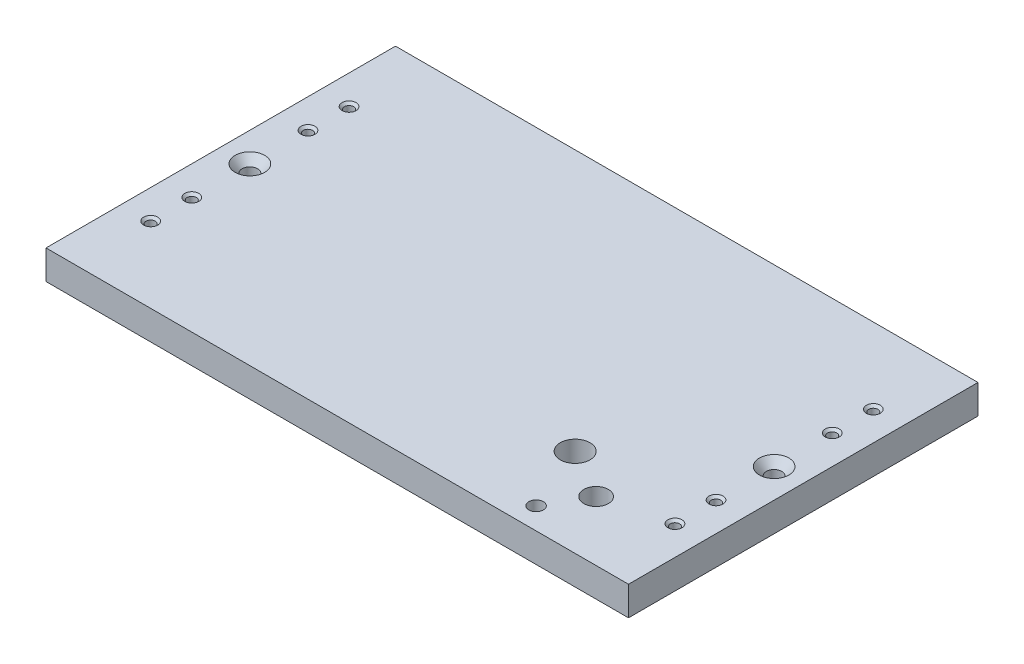
ISO-10303-21;
HEADER;
FILE_DESCRIPTION(('STEP AP214'),'2;1');
FILE_NAME('part.step','',(''),(''),'','','');
FILE_SCHEMA(('AUTOMOTIVE_DESIGN { 1 0 10303 214 1 1 1 1 }'));
ENDSEC;
DATA;
#1=APPLICATION_CONTEXT('core data for automotive mechanical design processes');
#2=APPLICATION_PROTOCOL_DEFINITION('international standard','automotive_design',2000,#1);
#3=PRODUCT_CONTEXT('',#1,'mechanical');
#4=PRODUCT('Part','Part','',(#3));
#5=PRODUCT_RELATED_PRODUCT_CATEGORY('part','',(#4));
#6=PRODUCT_DEFINITION_FORMATION('','',#4);
#7=PRODUCT_DEFINITION_CONTEXT('part definition',#1,'design');
#8=PRODUCT_DEFINITION('design','',#6,#7);
#9=PRODUCT_DEFINITION_SHAPE('','',#8);
#10=(LENGTH_UNIT() NAMED_UNIT(*) SI_UNIT(.MILLI.,.METRE.));
#11=(NAMED_UNIT(*) PLANE_ANGLE_UNIT() SI_UNIT($,.RADIAN.));
#12=(NAMED_UNIT(*) SI_UNIT($,.STERADIAN.) SOLID_ANGLE_UNIT());
#13=UNCERTAINTY_MEASURE_WITH_UNIT(LENGTH_MEASURE(1.E-05),#10,'distance_accuracy_value','');
#14=(GEOMETRIC_REPRESENTATION_CONTEXT(3) GLOBAL_UNCERTAINTY_ASSIGNED_CONTEXT((#13)) GLOBAL_UNIT_ASSIGNED_CONTEXT((#10,
#11,#12)) REPRESENTATION_CONTEXT('',''));
#15=CARTESIAN_POINT('',(0.,0.,0.));
#16=DIRECTION('',(0.,0.,1.));
#17=DIRECTION('',(1.,0.,0.));
#18=AXIS2_PLACEMENT_3D('',#15,#16,#17);
#19=CARTESIAN_POINT('',(0.,0.,0.));
#20=DIRECTION('',(0.,-1.,0.));
#21=DIRECTION('',(0.,0.,-1.));
#22=AXIS2_PLACEMENT_3D('',#19,#20,#21);
#23=PLANE('',#22);
#24=CARTESIAN_POINT('',(114.3,0.,0.));
#25=DIRECTION('',(0.,1.,0.));
#26=DIRECTION('',(0.,0.,1.));
#27=AXIS2_PLACEMENT_3D('',#24,#25,#26);
#28=CIRCLE('',#27,3.3782);
#29=CARTESIAN_POINT('',(114.3,0.,3.3782));
#30=VERTEX_POINT('',#29);
#31=EDGE_CURVE('E227',#30,#30,#28,.T.);
#32=ORIENTED_EDGE('',*,*,#31,.T.);
#33=EDGE_LOOP('',(#32));
#34=FACE_BOUND('',#33,.T.);
#35=CARTESIAN_POINT('',(-114.3,0.,0.));
#36=DIRECTION('',(0.,1.,0.));
#37=DIRECTION('',(0.,0.,1.));
#38=AXIS2_PLACEMENT_3D('',#35,#36,#37);
#39=CIRCLE('',#38,3.3782);
#40=CARTESIAN_POINT('',(-114.3,0.,3.3782));
#41=VERTEX_POINT('',#40);
#42=EDGE_CURVE('E217',#41,#41,#39,.T.);
#43=ORIENTED_EDGE('',*,*,#42,.T.);
#44=EDGE_LOOP('',(#43));
#45=FACE_BOUND('',#44,.T.);
#46=CARTESIAN_POINT('',(114.3,0.,-25.3365));
#47=DIRECTION('',(0.,1.,0.));
#48=DIRECTION('',(0.,0.,1.));
#49=AXIS2_PLACEMENT_3D('',#46,#47,#48);
#50=CIRCLE('',#49,2.0193);
#51=CARTESIAN_POINT('',(114.3,0.,-23.3172));
#52=VERTEX_POINT('',#51);
#53=EDGE_CURVE('E207',#52,#52,#50,.T.);
#54=ORIENTED_EDGE('',*,*,#53,.T.);
#55=EDGE_LOOP('',(#54));
#56=FACE_BOUND('',#55,.T.);
#57=CARTESIAN_POINT('',(-114.3,0.,-43.2435));
#58=DIRECTION('',(0.,1.,0.));
#59=DIRECTION('',(0.,0.,1.));
#60=AXIS2_PLACEMENT_3D('',#57,#58,#59);
#61=CIRCLE('',#60,2.0193);
#62=CARTESIAN_POINT('',(-114.3,0.,-41.2242));
#63=VERTEX_POINT('',#62);
#64=EDGE_CURVE('E157',#63,#63,#61,.T.);
#65=ORIENTED_EDGE('',*,*,#64,.T.);
#66=EDGE_LOOP('',(#65));
#67=FACE_BOUND('',#66,.T.);
#68=CARTESIAN_POINT('',(-114.3,0.,25.3365));
#69=DIRECTION('',(0.,1.,0.));
#70=DIRECTION('',(0.,0.,1.));
#71=AXIS2_PLACEMENT_3D('',#68,#69,#70);
#72=CIRCLE('',#71,2.0193);
#73=CARTESIAN_POINT('',(-114.3,0.,27.3558));
#74=VERTEX_POINT('',#73);
#75=EDGE_CURVE('E147',#74,#74,#72,.T.);
#76=ORIENTED_EDGE('',*,*,#75,.T.);
#77=EDGE_LOOP('',(#76));
#78=FACE_BOUND('',#77,.T.);
#79=CARTESIAN_POINT('',(-114.3,0.,43.2435));
#80=DIRECTION('',(0.,1.,0.));
#81=DIRECTION('',(0.,0.,1.));
#82=AXIS2_PLACEMENT_3D('',#79,#80,#81);
#83=CIRCLE('',#82,2.0193);
#84=CARTESIAN_POINT('',(-114.3,0.,45.2628));
#85=VERTEX_POINT('',#84);
#86=EDGE_CURVE('E134',#85,#85,#83,.T.);
#87=ORIENTED_EDGE('',*,*,#86,.T.);
#88=EDGE_LOOP('',(#87));
#89=FACE_BOUND('',#88,.T.);
#90=CARTESIAN_POINT('',(77.237896865954,0.,66.7200386784027));
#91=DIRECTION('',(0.,1.,0.));
#92=DIRECTION('',(0.,0.,1.));
#93=AXIS2_PLACEMENT_3D('',#90,#91,#92);
#94=CIRCLE('',#93,3.1623);
#95=CARTESIAN_POINT('',(77.237896865954,0.,69.8823386784027));
#96=VERTEX_POINT('',#95);
#97=EDGE_CURVE('E127',#96,#96,#94,.T.);
#98=ORIENTED_EDGE('',*,*,#97,.T.);
#99=EDGE_LOOP('',(#98));
#100=FACE_BOUND('',#99,.T.);
#101=CARTESIAN_POINT('',(65.1684117404341,0.,37.6250000610001));
#102=DIRECTION('',(0.,1.,0.));
#103=DIRECTION('',(0.,0.,1.));
#104=AXIS2_PLACEMENT_3D('',#101,#102,#103);
#105=CIRCLE('',#104,6.4897);
#106=CARTESIAN_POINT('',(65.1684117404341,0.,44.1147000610001));
#107=VERTEX_POINT('',#106);
#108=EDGE_CURVE('E120',#107,#107,#105,.T.);
#109=ORIENTED_EDGE('',*,*,#108,.T.);
#110=EDGE_LOOP('',(#109));
#111=FACE_BOUND('',#110,.T.);
#112=CARTESIAN_POINT('',(86.819046867954,0.,50.1250000800001));
#113=DIRECTION('',(0.,1.,0.));
#114=DIRECTION('',(0.,0.,1.));
#115=AXIS2_PLACEMENT_3D('',#112,#113,#114);
#116=CIRCLE('',#115,5.3578125);
#117=CARTESIAN_POINT('',(86.819046867954,0.,55.4828125800001));
#118=VERTEX_POINT('',#117);
#119=EDGE_CURVE('E105',#118,#118,#116,.T.);
#120=ORIENTED_EDGE('',*,*,#119,.T.);
#121=EDGE_LOOP('',(#120));
#122=FACE_BOUND('',#121,.T.);
#123=DIRECTION('',(0.,0.,-1.));
#124=VECTOR('',#123,1.);
#125=CARTESIAN_POINT('',(127.,0.,76.2));
#126=LINE('',#125,#124);
#127=CARTESIAN_POINT('',(127.,0.,76.2));
#128=VERTEX_POINT('',#127);
#129=CARTESIAN_POINT('',(127.,0.,-76.2));
#130=VERTEX_POINT('',#129);
#131=EDGE_CURVE('E72',#128,#130,#126,.T.);
#132=ORIENTED_EDGE('',*,*,#131,.F.);
#133=DIRECTION('',(1.,0.,0.));
#134=VECTOR('',#133,1.);
#135=CARTESIAN_POINT('',(-127.,0.,76.2));
#136=LINE('',#135,#134);
#137=CARTESIAN_POINT('',(-127.,0.,76.2));
#138=VERTEX_POINT('',#137);
#139=EDGE_CURVE('E94',#138,#128,#136,.T.);
#140=ORIENTED_EDGE('',*,*,#139,.F.);
#141=DIRECTION('',(0.,0.,1.));
#142=VECTOR('',#141,1.);
#143=CARTESIAN_POINT('',(-127.,0.,76.2));
#144=LINE('',#143,#142);
#145=CARTESIAN_POINT('',(-127.,0.,-76.2));
#146=VERTEX_POINT('',#145);
#147=EDGE_CURVE('E102',#146,#138,#144,.T.);
#148=ORIENTED_EDGE('',*,*,#147,.F.);
#149=DIRECTION('',(-1.,0.,0.));
#150=VECTOR('',#149,1.);
#151=CARTESIAN_POINT('',(-127.,0.,-76.2));
#152=LINE('',#151,#150);
#153=EDGE_CURVE('E78',#130,#146,#152,.T.);
#154=ORIENTED_EDGE('',*,*,#153,.F.);
#155=EDGE_LOOP('',(#132,#140,#148,#154));
#156=FACE_BOUND('',#155,.T.);
#157=CARTESIAN_POINT('',(-114.3,0.,-25.3365));
#158=DIRECTION('',(0.,1.,0.));
#159=DIRECTION('',(0.,0.,1.));
#160=AXIS2_PLACEMENT_3D('',#157,#158,#159);
#161=CIRCLE('',#160,2.0193);
#162=CARTESIAN_POINT('',(-114.3,0.,-23.3172));
#163=VERTEX_POINT('',#162);
#164=EDGE_CURVE('E167',#163,#163,#161,.T.);
#165=ORIENTED_EDGE('',*,*,#164,.T.);
#166=EDGE_LOOP('',(#165));
#167=FACE_BOUND('',#166,.T.);
#168=CARTESIAN_POINT('',(114.3,0.,43.2435));
#169=DIRECTION('',(0.,1.,0.));
#170=DIRECTION('',(0.,0.,1.));
#171=AXIS2_PLACEMENT_3D('',#168,#169,#170);
#172=CIRCLE('',#171,2.0193);
#173=CARTESIAN_POINT('',(114.3,0.,45.2628));
#174=VERTEX_POINT('',#173);
#175=EDGE_CURVE('E177',#174,#174,#172,.T.);
#176=ORIENTED_EDGE('',*,*,#175,.T.);
#177=EDGE_LOOP('',(#176));
#178=FACE_BOUND('',#177,.T.);
#179=CARTESIAN_POINT('',(114.3,0.,25.3365));
#180=DIRECTION('',(0.,1.,0.));
#181=DIRECTION('',(0.,0.,1.));
#182=AXIS2_PLACEMENT_3D('',#179,#180,#181);
#183=CIRCLE('',#182,2.0193);
#184=CARTESIAN_POINT('',(114.3,0.,27.3558));
#185=VERTEX_POINT('',#184);
#186=EDGE_CURVE('E187',#185,#185,#183,.T.);
#187=ORIENTED_EDGE('',*,*,#186,.T.);
#188=EDGE_LOOP('',(#187));
#189=FACE_BOUND('',#188,.T.);
#190=CARTESIAN_POINT('',(114.3,0.,-43.2435));
#191=DIRECTION('',(0.,1.,0.));
#192=DIRECTION('',(0.,0.,1.));
#193=AXIS2_PLACEMENT_3D('',#190,#191,#192);
#194=CIRCLE('',#193,2.0193);
#195=CARTESIAN_POINT('',(114.3,0.,-41.2242));
#196=VERTEX_POINT('',#195);
#197=EDGE_CURVE('E197',#196,#196,#194,.T.);
#198=ORIENTED_EDGE('',*,*,#197,.T.);
#199=EDGE_LOOP('',(#198));
#200=FACE_BOUND('',#199,.T.);
#201=ADVANCED_FACE('F38',(#34,#45,#56,#67,#78,#89,#100,#111,#122,#156,#167,#178,#189,#200),#23,.T.);
#202=CARTESIAN_POINT('',(-127.,12.7,76.2));
#203=DIRECTION('',(1.,0.,0.));
#204=DIRECTION('',(0.,0.,-1.));
#205=AXIS2_PLACEMENT_3D('',#202,#203,#204);
#206=PLANE('',#205);
#207=ORIENTED_EDGE('',*,*,#147,.T.);
#208=DIRECTION('',(0.,-1.,0.));
#209=VECTOR('',#208,1.);
#210=CARTESIAN_POINT('',(-127.,12.7,76.2));
#211=LINE('',#210,#209);
#212=CARTESIAN_POINT('',(-127.,12.7,76.2));
#213=VERTEX_POINT('',#212);
#214=EDGE_CURVE('E11',#213,#138,#211,.T.);
#215=ORIENTED_EDGE('',*,*,#214,.F.);
#216=DIRECTION('',(0.,0.,1.));
#217=VECTOR('',#216,1.);
#218=CARTESIAN_POINT('',(-127.,12.7,76.2));
#219=LINE('',#218,#217);
#220=CARTESIAN_POINT('',(-127.,12.7,-76.2));
#221=VERTEX_POINT('',#220);
#222=EDGE_CURVE('E90',#221,#213,#219,.T.);
#223=ORIENTED_EDGE('',*,*,#222,.F.);
#224=DIRECTION('',(0.,-1.,0.));
#225=VECTOR('',#224,1.);
#226=CARTESIAN_POINT('',(-127.,12.7,-76.2));
#227=LINE('',#226,#225);
#228=EDGE_CURVE('E98',#221,#146,#227,.T.);
#229=ORIENTED_EDGE('',*,*,#228,.T.);
#230=EDGE_LOOP('',(#207,#215,#223,#229));
#231=FACE_BOUND('',#230,.T.);
#232=ADVANCED_FACE('F40',(#231),#206,.F.);
#233=CARTESIAN_POINT('',(-127.,12.7,76.2));
#234=DIRECTION('',(0.,0.,-1.));
#235=DIRECTION('',(-1.,0.,0.));
#236=AXIS2_PLACEMENT_3D('',#233,#234,#235);
#237=PLANE('',#236);
#238=DIRECTION('',(0.,-1.,0.));
#239=VECTOR('',#238,1.);
#240=CARTESIAN_POINT('',(127.,12.7,76.2));
#241=LINE('',#240,#239);
#242=CARTESIAN_POINT('',(127.,12.7,76.2));
#243=VERTEX_POINT('',#242);
#244=EDGE_CURVE('E47',#243,#128,#241,.T.);
#245=ORIENTED_EDGE('',*,*,#244,.F.);
#246=DIRECTION('',(1.,0.,0.));
#247=VECTOR('',#246,1.);
#248=CARTESIAN_POINT('',(-127.,12.7,76.2));
#249=LINE('',#248,#247);
#250=EDGE_CURVE('E85',#213,#243,#249,.T.);
#251=ORIENTED_EDGE('',*,*,#250,.F.);
#252=ORIENTED_EDGE('',*,*,#214,.T.);
#253=ORIENTED_EDGE('',*,*,#139,.T.);
#254=EDGE_LOOP('',(#245,#251,#252,#253));
#255=FACE_BOUND('',#254,.T.);
#256=ADVANCED_FACE('F93',(#255),#237,.F.);
#257=CARTESIAN_POINT('',(127.,12.7,76.2));
#258=DIRECTION('',(-1.,0.,0.));
#259=DIRECTION('',(0.,0.,1.));
#260=AXIS2_PLACEMENT_3D('',#257,#258,#259);
#261=PLANE('',#260);
#262=ORIENTED_EDGE('',*,*,#131,.T.);
#263=DIRECTION('',(0.,-1.,0.));
#264=VECTOR('',#263,1.);
#265=CARTESIAN_POINT('',(127.,12.7,-76.2));
#266=LINE('',#265,#264);
#267=CARTESIAN_POINT('',(127.,12.7,-76.2));
#268=VERTEX_POINT('',#267);
#269=EDGE_CURVE('E95',#268,#130,#266,.T.);
#270=ORIENTED_EDGE('',*,*,#269,.F.);
#271=DIRECTION('',(0.,0.,-1.));
#272=VECTOR('',#271,1.);
#273=CARTESIAN_POINT('',(127.,12.7,76.2));
#274=LINE('',#273,#272);
#275=EDGE_CURVE('E88',#243,#268,#274,.T.);
#276=ORIENTED_EDGE('',*,*,#275,.F.);
#277=ORIENTED_EDGE('',*,*,#244,.T.);
#278=EDGE_LOOP('',(#262,#270,#276,#277));
#279=FACE_BOUND('',#278,.T.);
#280=ADVANCED_FACE('F96',(#279),#261,.F.);
#281=CARTESIAN_POINT('',(-127.,12.7,-76.2));
#282=DIRECTION('',(0.,0.,1.));
#283=DIRECTION('',(1.,0.,0.));
#284=AXIS2_PLACEMENT_3D('',#281,#282,#283);
#285=PLANE('',#284);
#286=ORIENTED_EDGE('',*,*,#228,.F.);
#287=DIRECTION('',(-1.,0.,0.));
#288=VECTOR('',#287,1.);
#289=CARTESIAN_POINT('',(-127.,12.7,-76.2));
#290=LINE('',#289,#288);
#291=EDGE_CURVE('E55',#268,#221,#290,.T.);
#292=ORIENTED_EDGE('',*,*,#291,.F.);
#293=ORIENTED_EDGE('',*,*,#269,.T.);
#294=ORIENTED_EDGE('',*,*,#153,.T.);
#295=EDGE_LOOP('',(#286,#292,#293,#294));
#296=FACE_BOUND('',#295,.T.);
#297=ADVANCED_FACE('F110',(#296),#285,.F.);
#298=CARTESIAN_POINT('',(0.,12.7,0.));
#299=DIRECTION('',(0.,-1.,0.));
#300=DIRECTION('',(0.,0.,-1.));
#301=AXIS2_PLACEMENT_3D('',#298,#299,#300);
#302=PLANE('',#301);
#303=CARTESIAN_POINT('',(114.3,12.7,0.));
#304=DIRECTION('',(0.,1.,0.));
#305=DIRECTION('',(0.,0.,1.));
#306=AXIS2_PLACEMENT_3D('',#303,#304,#305);
#307=CIRCLE('',#306,6.4389);
#308=CARTESIAN_POINT('',(114.3,12.7,6.4389));
#309=VERTEX_POINT('',#308);
#310=EDGE_CURVE('E233',#309,#309,#307,.T.);
#311=ORIENTED_EDGE('',*,*,#310,.F.);
#312=EDGE_LOOP('',(#311));
#313=FACE_BOUND('',#312,.T.);
#314=CARTESIAN_POINT('',(-114.3,12.7,0.));
#315=DIRECTION('',(0.,1.,0.));
#316=DIRECTION('',(0.,0.,1.));
#317=AXIS2_PLACEMENT_3D('',#314,#315,#316);
#318=CIRCLE('',#317,6.4389);
#319=CARTESIAN_POINT('',(-114.3,12.7,6.4389));
#320=VERTEX_POINT('',#319);
#321=EDGE_CURVE('E223',#320,#320,#318,.T.);
#322=ORIENTED_EDGE('',*,*,#321,.F.);
#323=EDGE_LOOP('',(#322));
#324=FACE_BOUND('',#323,.T.);
#325=CARTESIAN_POINT('',(114.3,12.7,-25.3365));
#326=DIRECTION('',(0.,1.,0.));
#327=DIRECTION('',(0.,0.,1.));
#328=AXIS2_PLACEMENT_3D('',#325,#326,#327);
#329=CIRCLE('',#328,3.048);
#330=CARTESIAN_POINT('',(114.3,12.7,-22.2885));
#331=VERTEX_POINT('',#330);
#332=EDGE_CURVE('E213',#331,#331,#329,.T.);
#333=ORIENTED_EDGE('',*,*,#332,.F.);
#334=EDGE_LOOP('',(#333));
#335=FACE_BOUND('',#334,.T.);
#336=CARTESIAN_POINT('',(114.3,12.7,-43.2435));
#337=DIRECTION('',(0.,1.,0.));
#338=DIRECTION('',(0.,0.,1.));
#339=AXIS2_PLACEMENT_3D('',#336,#337,#338);
#340=CIRCLE('',#339,3.048);
#341=CARTESIAN_POINT('',(114.3,12.7,-40.1955));
#342=VERTEX_POINT('',#341);
#343=EDGE_CURVE('E203',#342,#342,#340,.T.);
#344=ORIENTED_EDGE('',*,*,#343,.F.);
#345=EDGE_LOOP('',(#344));
#346=FACE_BOUND('',#345,.T.);
#347=CARTESIAN_POINT('',(114.3,12.7,25.3365));
#348=DIRECTION('',(0.,1.,0.));
#349=DIRECTION('',(0.,0.,1.));
#350=AXIS2_PLACEMENT_3D('',#347,#348,#349);
#351=CIRCLE('',#350,3.048);
#352=CARTESIAN_POINT('',(114.3,12.7,28.3845));
#353=VERTEX_POINT('',#352);
#354=EDGE_CURVE('E193',#353,#353,#351,.T.);
#355=ORIENTED_EDGE('',*,*,#354,.F.);
#356=EDGE_LOOP('',(#355));
#357=FACE_BOUND('',#356,.T.);
#358=CARTESIAN_POINT('',(114.3,12.7,43.2435));
#359=DIRECTION('',(0.,1.,0.));
#360=DIRECTION('',(0.,0.,1.));
#361=AXIS2_PLACEMENT_3D('',#358,#359,#360);
#362=CIRCLE('',#361,3.048);
#363=CARTESIAN_POINT('',(114.3,12.7,46.2915));
#364=VERTEX_POINT('',#363);
#365=EDGE_CURVE('E183',#364,#364,#362,.T.);
#366=ORIENTED_EDGE('',*,*,#365,.F.);
#367=EDGE_LOOP('',(#366));
#368=FACE_BOUND('',#367,.T.);
#369=CARTESIAN_POINT('',(-114.3,12.7,-25.3365));
#370=DIRECTION('',(0.,1.,0.));
#371=DIRECTION('',(0.,0.,1.));
#372=AXIS2_PLACEMENT_3D('',#369,#370,#371);
#373=CIRCLE('',#372,3.048);
#374=CARTESIAN_POINT('',(-114.3,12.7,-22.2885));
#375=VERTEX_POINT('',#374);
#376=EDGE_CURVE('E173',#375,#375,#373,.T.);
#377=ORIENTED_EDGE('',*,*,#376,.F.);
#378=EDGE_LOOP('',(#377));
#379=FACE_BOUND('',#378,.T.);
#380=CARTESIAN_POINT('',(-114.3,12.7,-43.2435));
#381=DIRECTION('',(0.,1.,0.));
#382=DIRECTION('',(0.,0.,1.));
#383=AXIS2_PLACEMENT_3D('',#380,#381,#382);
#384=CIRCLE('',#383,3.048);
#385=CARTESIAN_POINT('',(-114.3,12.7,-40.1955));
#386=VERTEX_POINT('',#385);
#387=EDGE_CURVE('E163',#386,#386,#384,.T.);
#388=ORIENTED_EDGE('',*,*,#387,.F.);
#389=EDGE_LOOP('',(#388));
#390=FACE_BOUND('',#389,.T.);
#391=CARTESIAN_POINT('',(-114.3,12.7,25.3365));
#392=DIRECTION('',(0.,1.,0.));
#393=DIRECTION('',(0.,0.,1.));
#394=AXIS2_PLACEMENT_3D('',#391,#392,#393);
#395=CIRCLE('',#394,3.048);
#396=CARTESIAN_POINT('',(-114.3,12.7,28.3845));
#397=VERTEX_POINT('',#396);
#398=EDGE_CURVE('E153',#397,#397,#395,.T.);
#399=ORIENTED_EDGE('',*,*,#398,.F.);
#400=EDGE_LOOP('',(#399));
#401=FACE_BOUND('',#400,.T.);
#402=CARTESIAN_POINT('',(-114.3,12.7,43.2435));
#403=DIRECTION('',(0.,1.,0.));
#404=DIRECTION('',(0.,0.,1.));
#405=AXIS2_PLACEMENT_3D('',#402,#403,#404);
#406=CIRCLE('',#405,3.048);
#407=CARTESIAN_POINT('',(-114.3,12.7,46.2915));
#408=VERTEX_POINT('',#407);
#409=EDGE_CURVE('E143',#408,#408,#406,.T.);
#410=ORIENTED_EDGE('',*,*,#409,.F.);
#411=EDGE_LOOP('',(#410));
#412=FACE_BOUND('',#411,.T.);
#413=CARTESIAN_POINT('',(77.237896865954,12.7,66.7200386784027));
#414=DIRECTION('',(0.,1.,0.));
#415=DIRECTION('',(0.,0.,1.));
#416=AXIS2_PLACEMENT_3D('',#413,#414,#415);
#417=CIRCLE('',#416,3.1623);
#418=CARTESIAN_POINT('',(77.237896865954,12.7,69.8823386784027));
#419=VERTEX_POINT('',#418);
#420=EDGE_CURVE('E130',#419,#419,#417,.T.);
#421=ORIENTED_EDGE('',*,*,#420,.F.);
#422=EDGE_LOOP('',(#421));
#423=FACE_BOUND('',#422,.T.);
#424=CARTESIAN_POINT('',(65.1684117404341,12.7,37.6250000610001));
#425=DIRECTION('',(0.,1.,0.));
#426=DIRECTION('',(0.,0.,1.));
#427=AXIS2_PLACEMENT_3D('',#424,#425,#426);
#428=CIRCLE('',#427,6.4897);
#429=CARTESIAN_POINT('',(65.1684117404341,12.7,44.1147000610001));
#430=VERTEX_POINT('',#429);
#431=EDGE_CURVE('E123',#430,#430,#428,.T.);
#432=ORIENTED_EDGE('',*,*,#431,.F.);
#433=EDGE_LOOP('',(#432));
#434=FACE_BOUND('',#433,.T.);
#435=CARTESIAN_POINT('',(86.819046867954,12.7,50.1250000800001));
#436=DIRECTION('',(0.,1.,0.));
#437=DIRECTION('',(0.,0.,1.));
#438=AXIS2_PLACEMENT_3D('',#435,#436,#437);
#439=CIRCLE('',#438,5.3578125);
#440=CARTESIAN_POINT('',(86.819046867954,12.7,55.4828125800001));
#441=VERTEX_POINT('',#440);
#442=EDGE_CURVE('E116',#441,#441,#439,.T.);
#443=ORIENTED_EDGE('',*,*,#442,.F.);
#444=EDGE_LOOP('',(#443));
#445=FACE_BOUND('',#444,.T.);
#446=ORIENTED_EDGE('',*,*,#250,.T.);
#447=ORIENTED_EDGE('',*,*,#275,.T.);
#448=ORIENTED_EDGE('',*,*,#291,.T.);
#449=ORIENTED_EDGE('',*,*,#222,.T.);
#450=EDGE_LOOP('',(#446,#447,#448,#449));
#451=FACE_BOUND('',#450,.T.);
#452=ADVANCED_FACE('F86',(#313,#324,#335,#346,#357,#368,#379,#390,#401,#412,#423,#434,#445,
#451),#302,.F.);
#453=CARTESIAN_POINT('',(86.819046867954,0.,50.1250000800001));
#454=DIRECTION('',(0.,1.,0.));
#455=DIRECTION('',(0.,0.,1.));
#456=AXIS2_PLACEMENT_3D('',#453,#454,#455);
#457=CYLINDRICAL_SURFACE('',#456,5.3578125);
#458=ORIENTED_EDGE('',*,*,#119,.F.);
#459=EDGE_LOOP('',(#458));
#460=FACE_BOUND('',#459,.T.);
#461=ORIENTED_EDGE('',*,*,#442,.T.);
#462=EDGE_LOOP('',(#461));
#463=FACE_BOUND('',#462,.T.);
#464=ADVANCED_FACE('F247',(#460,#463),#457,.F.);
#465=CARTESIAN_POINT('',(65.1684117404341,0.,37.6250000610001));
#466=DIRECTION('',(0.,1.,0.));
#467=DIRECTION('',(0.,0.,1.));
#468=AXIS2_PLACEMENT_3D('',#465,#466,#467);
#469=CYLINDRICAL_SURFACE('',#468,6.4897);
#470=ORIENTED_EDGE('',*,*,#108,.F.);
#471=EDGE_LOOP('',(#470));
#472=FACE_BOUND('',#471,.T.);
#473=ORIENTED_EDGE('',*,*,#431,.T.);
#474=EDGE_LOOP('',(#473));
#475=FACE_BOUND('',#474,.T.);
#476=ADVANCED_FACE('F310',(#472,#475),#469,.F.);
#477=CARTESIAN_POINT('',(77.237896865954,0.,66.7200386784027));
#478=DIRECTION('',(0.,1.,0.));
#479=DIRECTION('',(0.,0.,1.));
#480=AXIS2_PLACEMENT_3D('',#477,#478,#479);
#481=CYLINDRICAL_SURFACE('',#480,3.1623);
#482=ORIENTED_EDGE('',*,*,#97,.F.);
#483=EDGE_LOOP('',(#482));
#484=FACE_BOUND('',#483,.T.);
#485=ORIENTED_EDGE('',*,*,#420,.T.);
#486=EDGE_LOOP('',(#485));
#487=FACE_BOUND('',#486,.T.);
#488=ADVANCED_FACE('F316',(#484,#487),#481,.F.);
#489=CARTESIAN_POINT('',(-114.3,12.7,43.2435));
#490=DIRECTION('',(0.,1.,0.));
#491=DIRECTION('',(0.,0.,1.));
#492=AXIS2_PLACEMENT_3D('',#489,#490,#491);
#493=CYLINDRICAL_SURFACE('',#492,2.01929999999999);
#494=ORIENTED_EDGE('',*,*,#86,.F.);
#495=EDGE_LOOP('',(#494));
#496=FACE_BOUND('',#495,.T.);
#497=CARTESIAN_POINT('',(-114.3,11.6713,43.2435));
#498=DIRECTION('',(0.,1.,0.));
#499=DIRECTION('',(0.,0.,1.));
#500=AXIS2_PLACEMENT_3D('',#497,#498,#499);
#501=CIRCLE('',#500,2.01929999999999);
#502=CARTESIAN_POINT('',(-114.3,11.6713,45.2628));
#503=VERTEX_POINT('',#502);
#504=EDGE_CURVE('E139',#503,#503,#501,.T.);
#505=ORIENTED_EDGE('',*,*,#504,.T.);
#506=EDGE_LOOP('',(#505));
#507=FACE_BOUND('',#506,.T.);
#508=ADVANCED_FACE('F446',(#496,#507),#493,.F.);
#509=CARTESIAN_POINT('',(-114.3,12.7,43.2435));
#510=DIRECTION('',(0.,1.,0.));
#511=DIRECTION('',(0.,0.,1.));
#512=AXIS2_PLACEMENT_3D('',#509,#510,#511);
#513=CONICAL_SURFACE('',#512,3.048,0.785398163397448);
#514=ORIENTED_EDGE('',*,*,#504,.F.);
#515=EDGE_LOOP('',(#514));
#516=FACE_BOUND('',#515,.T.);
#517=ORIENTED_EDGE('',*,*,#409,.T.);
#518=EDGE_LOOP('',(#517));
#519=FACE_BOUND('',#518,.T.);
#520=ADVANCED_FACE('F442',(#516,#519),#513,.F.);
#521=CARTESIAN_POINT('',(-114.3,12.7,25.3365));
#522=DIRECTION('',(0.,1.,0.));
#523=DIRECTION('',(0.,0.,1.));
#524=AXIS2_PLACEMENT_3D('',#521,#522,#523);
#525=CYLINDRICAL_SURFACE('',#524,2.01929999999999);
#526=ORIENTED_EDGE('',*,*,#75,.F.);
#527=EDGE_LOOP('',(#526));
#528=FACE_BOUND('',#527,.T.);
#529=CARTESIAN_POINT('',(-114.3,11.6713,25.3365));
#530=DIRECTION('',(0.,1.,0.));
#531=DIRECTION('',(0.,0.,1.));
#532=AXIS2_PLACEMENT_3D('',#529,#530,#531);
#533=CIRCLE('',#532,2.01929999999999);
#534=CARTESIAN_POINT('',(-114.3,11.6713,27.3558));
#535=VERTEX_POINT('',#534);
#536=EDGE_CURVE('E150',#535,#535,#533,.T.);
#537=ORIENTED_EDGE('',*,*,#536,.T.);
#538=EDGE_LOOP('',(#537));
#539=FACE_BOUND('',#538,.T.);
#540=ADVANCED_FACE('F438',(#528,#539),#525,.F.);
#541=CARTESIAN_POINT('',(-114.3,12.7,25.3365));
#542=DIRECTION('',(0.,1.,0.));
#543=DIRECTION('',(0.,0.,1.));
#544=AXIS2_PLACEMENT_3D('',#541,#542,#543);
#545=CONICAL_SURFACE('',#544,3.048,0.785398163397448);
#546=ORIENTED_EDGE('',*,*,#536,.F.);
#547=EDGE_LOOP('',(#546));
#548=FACE_BOUND('',#547,.T.);
#549=ORIENTED_EDGE('',*,*,#398,.T.);
#550=EDGE_LOOP('',(#549));
#551=FACE_BOUND('',#550,.T.);
#552=ADVANCED_FACE('F434',(#548,#551),#545,.F.);
#553=CARTESIAN_POINT('',(-114.3,12.7,-43.2435));
#554=DIRECTION('',(0.,1.,0.));
#555=DIRECTION('',(0.,0.,1.));
#556=AXIS2_PLACEMENT_3D('',#553,#554,#555);
#557=CYLINDRICAL_SURFACE('',#556,2.01929999999999);
#558=ORIENTED_EDGE('',*,*,#64,.F.);
#559=EDGE_LOOP('',(#558));
#560=FACE_BOUND('',#559,.T.);
#561=CARTESIAN_POINT('',(-114.3,11.6713,-43.2435));
#562=DIRECTION('',(0.,1.,0.));
#563=DIRECTION('',(0.,0.,1.));
#564=AXIS2_PLACEMENT_3D('',#561,#562,#563);
#565=CIRCLE('',#564,2.01929999999999);
#566=CARTESIAN_POINT('',(-114.3,11.6713,-41.2242));
#567=VERTEX_POINT('',#566);
#568=EDGE_CURVE('E160',#567,#567,#565,.T.);
#569=ORIENTED_EDGE('',*,*,#568,.T.);
#570=EDGE_LOOP('',(#569));
#571=FACE_BOUND('',#570,.T.);
#572=ADVANCED_FACE('F430',(#560,#571),#557,.F.);
#573=CARTESIAN_POINT('',(-114.3,12.7,-43.2435));
#574=DIRECTION('',(0.,1.,0.));
#575=DIRECTION('',(0.,0.,1.));
#576=AXIS2_PLACEMENT_3D('',#573,#574,#575);
#577=CONICAL_SURFACE('',#576,3.048,0.785398163397448);
#578=ORIENTED_EDGE('',*,*,#568,.F.);
#579=EDGE_LOOP('',(#578));
#580=FACE_BOUND('',#579,.T.);
#581=ORIENTED_EDGE('',*,*,#387,.T.);
#582=EDGE_LOOP('',(#581));
#583=FACE_BOUND('',#582,.T.);
#584=ADVANCED_FACE('F426',(#580,#583),#577,.F.);
#585=CARTESIAN_POINT('',(-114.3,12.7,-25.3365));
#586=DIRECTION('',(0.,1.,0.));
#587=DIRECTION('',(0.,0.,1.));
#588=AXIS2_PLACEMENT_3D('',#585,#586,#587);
#589=CYLINDRICAL_SURFACE('',#588,2.01929999999999);
#590=ORIENTED_EDGE('',*,*,#164,.F.);
#591=EDGE_LOOP('',(#590));
#592=FACE_BOUND('',#591,.T.);
#593=CARTESIAN_POINT('',(-114.3,11.6713,-25.3365));
#594=DIRECTION('',(0.,1.,0.));
#595=DIRECTION('',(0.,0.,1.));
#596=AXIS2_PLACEMENT_3D('',#593,#594,#595);
#597=CIRCLE('',#596,2.01929999999999);
#598=CARTESIAN_POINT('',(-114.3,11.6713,-23.3172));
#599=VERTEX_POINT('',#598);
#600=EDGE_CURVE('E170',#599,#599,#597,.T.);
#601=ORIENTED_EDGE('',*,*,#600,.T.);
#602=EDGE_LOOP('',(#601));
#603=FACE_BOUND('',#602,.T.);
#604=ADVANCED_FACE('F422',(#592,#603),#589,.F.);
#605=CARTESIAN_POINT('',(-114.3,12.7,-25.3365));
#606=DIRECTION('',(0.,1.,0.));
#607=DIRECTION('',(0.,0.,1.));
#608=AXIS2_PLACEMENT_3D('',#605,#606,#607);
#609=CONICAL_SURFACE('',#608,3.048,0.785398163397448);
#610=ORIENTED_EDGE('',*,*,#600,.F.);
#611=EDGE_LOOP('',(#610));
#612=FACE_BOUND('',#611,.T.);
#613=ORIENTED_EDGE('',*,*,#376,.T.);
#614=EDGE_LOOP('',(#613));
#615=FACE_BOUND('',#614,.T.);
#616=ADVANCED_FACE('F418',(#612,#615),#609,.F.);
#617=CARTESIAN_POINT('',(114.3,12.7,43.2435));
#618=DIRECTION('',(0.,1.,0.));
#619=DIRECTION('',(0.,0.,1.));
#620=AXIS2_PLACEMENT_3D('',#617,#618,#619);
#621=CYLINDRICAL_SURFACE('',#620,2.01929999999999);
#622=ORIENTED_EDGE('',*,*,#175,.F.);
#623=EDGE_LOOP('',(#622));
#624=FACE_BOUND('',#623,.T.);
#625=CARTESIAN_POINT('',(114.3,11.6713,43.2435));
#626=DIRECTION('',(0.,1.,0.));
#627=DIRECTION('',(0.,0.,1.));
#628=AXIS2_PLACEMENT_3D('',#625,#626,#627);
#629=CIRCLE('',#628,2.01929999999999);
#630=CARTESIAN_POINT('',(114.3,11.6713,45.2628));
#631=VERTEX_POINT('',#630);
#632=EDGE_CURVE('E180',#631,#631,#629,.T.);
#633=ORIENTED_EDGE('',*,*,#632,.T.);
#634=EDGE_LOOP('',(#633));
#635=FACE_BOUND('',#634,.T.);
#636=ADVANCED_FACE('F414',(#624,#635),#621,.F.);
#637=CARTESIAN_POINT('',(114.3,12.7,43.2435));
#638=DIRECTION('',(0.,1.,0.));
#639=DIRECTION('',(0.,0.,1.));
#640=AXIS2_PLACEMENT_3D('',#637,#638,#639);
#641=CONICAL_SURFACE('',#640,3.048,0.785398163397448);
#642=ORIENTED_EDGE('',*,*,#632,.F.);
#643=EDGE_LOOP('',(#642));
#644=FACE_BOUND('',#643,.T.);
#645=ORIENTED_EDGE('',*,*,#365,.T.);
#646=EDGE_LOOP('',(#645));
#647=FACE_BOUND('',#646,.T.);
#648=ADVANCED_FACE('F410',(#644,#647),#641,.F.);
#649=CARTESIAN_POINT('',(114.3,12.7,25.3365));
#650=DIRECTION('',(0.,1.,0.));
#651=DIRECTION('',(0.,0.,1.));
#652=AXIS2_PLACEMENT_3D('',#649,#650,#651);
#653=CYLINDRICAL_SURFACE('',#652,2.01929999999999);
#654=ORIENTED_EDGE('',*,*,#186,.F.);
#655=EDGE_LOOP('',(#654));
#656=FACE_BOUND('',#655,.T.);
#657=CARTESIAN_POINT('',(114.3,11.6713,25.3365));
#658=DIRECTION('',(0.,1.,0.));
#659=DIRECTION('',(0.,0.,1.));
#660=AXIS2_PLACEMENT_3D('',#657,#658,#659);
#661=CIRCLE('',#660,2.01929999999999);
#662=CARTESIAN_POINT('',(114.3,11.6713,27.3558));
#663=VERTEX_POINT('',#662);
#664=EDGE_CURVE('E190',#663,#663,#661,.T.);
#665=ORIENTED_EDGE('',*,*,#664,.T.);
#666=EDGE_LOOP('',(#665));
#667=FACE_BOUND('',#666,.T.);
#668=ADVANCED_FACE('F406',(#656,#667),#653,.F.);
#669=CARTESIAN_POINT('',(114.3,12.7,25.3365));
#670=DIRECTION('',(0.,1.,0.));
#671=DIRECTION('',(0.,0.,1.));
#672=AXIS2_PLACEMENT_3D('',#669,#670,#671);
#673=CONICAL_SURFACE('',#672,3.048,0.785398163397448);
#674=ORIENTED_EDGE('',*,*,#664,.F.);
#675=EDGE_LOOP('',(#674));
#676=FACE_BOUND('',#675,.T.);
#677=ORIENTED_EDGE('',*,*,#354,.T.);
#678=EDGE_LOOP('',(#677));
#679=FACE_BOUND('',#678,.T.);
#680=ADVANCED_FACE('F402',(#676,#679),#673,.F.);
#681=CARTESIAN_POINT('',(114.3,12.7,-43.2435));
#682=DIRECTION('',(0.,1.,0.));
#683=DIRECTION('',(0.,0.,1.));
#684=AXIS2_PLACEMENT_3D('',#681,#682,#683);
#685=CYLINDRICAL_SURFACE('',#684,2.01929999999999);
#686=ORIENTED_EDGE('',*,*,#197,.F.);
#687=EDGE_LOOP('',(#686));
#688=FACE_BOUND('',#687,.T.);
#689=CARTESIAN_POINT('',(114.3,11.6713,-43.2435));
#690=DIRECTION('',(0.,1.,0.));
#691=DIRECTION('',(0.,0.,1.));
#692=AXIS2_PLACEMENT_3D('',#689,#690,#691);
#693=CIRCLE('',#692,2.01929999999999);
#694=CARTESIAN_POINT('',(114.3,11.6713,-41.2242));
#695=VERTEX_POINT('',#694);
#696=EDGE_CURVE('E200',#695,#695,#693,.T.);
#697=ORIENTED_EDGE('',*,*,#696,.T.);
#698=EDGE_LOOP('',(#697));
#699=FACE_BOUND('',#698,.T.);
#700=ADVANCED_FACE('F398',(#688,#699),#685,.F.);
#701=CARTESIAN_POINT('',(114.3,12.7,-43.2435));
#702=DIRECTION('',(0.,1.,0.));
#703=DIRECTION('',(0.,0.,1.));
#704=AXIS2_PLACEMENT_3D('',#701,#702,#703);
#705=CONICAL_SURFACE('',#704,3.048,0.785398163397448);
#706=ORIENTED_EDGE('',*,*,#696,.F.);
#707=EDGE_LOOP('',(#706));
#708=FACE_BOUND('',#707,.T.);
#709=ORIENTED_EDGE('',*,*,#343,.T.);
#710=EDGE_LOOP('',(#709));
#711=FACE_BOUND('',#710,.T.);
#712=ADVANCED_FACE('F394',(#708,#711),#705,.F.);
#713=CARTESIAN_POINT('',(114.3,12.7,-25.3365));
#714=DIRECTION('',(0.,1.,0.));
#715=DIRECTION('',(0.,0.,1.));
#716=AXIS2_PLACEMENT_3D('',#713,#714,#715);
#717=CYLINDRICAL_SURFACE('',#716,2.01929999999999);
#718=ORIENTED_EDGE('',*,*,#53,.F.);
#719=EDGE_LOOP('',(#718));
#720=FACE_BOUND('',#719,.T.);
#721=CARTESIAN_POINT('',(114.3,11.6713,-25.3365));
#722=DIRECTION('',(0.,1.,0.));
#723=DIRECTION('',(0.,0.,1.));
#724=AXIS2_PLACEMENT_3D('',#721,#722,#723);
#725=CIRCLE('',#724,2.01929999999999);
#726=CARTESIAN_POINT('',(114.3,11.6713,-23.3172));
#727=VERTEX_POINT('',#726);
#728=EDGE_CURVE('E210',#727,#727,#725,.T.);
#729=ORIENTED_EDGE('',*,*,#728,.T.);
#730=EDGE_LOOP('',(#729));
#731=FACE_BOUND('',#730,.T.);
#732=ADVANCED_FACE('F390',(#720,#731),#717,.F.);
#733=CARTESIAN_POINT('',(114.3,12.7,-25.3365));
#734=DIRECTION('',(0.,1.,0.));
#735=DIRECTION('',(0.,0.,1.));
#736=AXIS2_PLACEMENT_3D('',#733,#734,#735);
#737=CONICAL_SURFACE('',#736,3.048,0.785398163397448);
#738=ORIENTED_EDGE('',*,*,#728,.F.);
#739=EDGE_LOOP('',(#738));
#740=FACE_BOUND('',#739,.T.);
#741=ORIENTED_EDGE('',*,*,#332,.T.);
#742=EDGE_LOOP('',(#741));
#743=FACE_BOUND('',#742,.T.);
#744=ADVANCED_FACE('F386',(#740,#743),#737,.F.);
#745=CARTESIAN_POINT('',(-114.3,12.7,0.));
#746=DIRECTION('',(0.,1.,0.));
#747=DIRECTION('',(0.,0.,1.));
#748=AXIS2_PLACEMENT_3D('',#745,#746,#747);
#749=CYLINDRICAL_SURFACE('',#748,3.3782);
#750=ORIENTED_EDGE('',*,*,#42,.F.);
#751=EDGE_LOOP('',(#750));
#752=FACE_BOUND('',#751,.T.);
#753=CARTESIAN_POINT('',(-114.3,9.17906741601866,0.));
#754=DIRECTION('',(0.,1.,0.));
#755=DIRECTION('',(0.,0.,1.));
#756=AXIS2_PLACEMENT_3D('',#753,#754,#755);
#757=CIRCLE('',#756,3.3782);
#758=CARTESIAN_POINT('',(-114.3,9.17906741601866,3.3782));
#759=VERTEX_POINT('',#758);
#760=EDGE_CURVE('E220',#759,#759,#757,.T.);
#761=ORIENTED_EDGE('',*,*,#760,.T.);
#762=EDGE_LOOP('',(#761));
#763=FACE_BOUND('',#762,.T.);
#764=ADVANCED_FACE('F382',(#752,#763),#749,.F.);
#765=CARTESIAN_POINT('',(-114.3,12.7,0.));
#766=DIRECTION('',(0.,1.,0.));
#767=DIRECTION('',(0.,0.,1.));
#768=AXIS2_PLACEMENT_3D('',#765,#766,#767);
#769=CONICAL_SURFACE('',#768,6.4389,0.715584993317675);
#770=ORIENTED_EDGE('',*,*,#760,.F.);
#771=EDGE_LOOP('',(#770));
#772=FACE_BOUND('',#771,.T.);
#773=ORIENTED_EDGE('',*,*,#321,.T.);
#774=EDGE_LOOP('',(#773));
#775=FACE_BOUND('',#774,.T.);
#776=ADVANCED_FACE('F363',(#772,#775),#769,.F.);
#777=CARTESIAN_POINT('',(114.3,12.7,0.));
#778=DIRECTION('',(0.,1.,0.));
#779=DIRECTION('',(0.,0.,1.));
#780=AXIS2_PLACEMENT_3D('',#777,#778,#779);
#781=CYLINDRICAL_SURFACE('',#780,3.3782);
#782=ORIENTED_EDGE('',*,*,#31,.F.);
#783=EDGE_LOOP('',(#782));
#784=FACE_BOUND('',#783,.T.);
#785=CARTESIAN_POINT('',(114.3,9.17906741601866,0.));
#786=DIRECTION('',(0.,1.,0.));
#787=DIRECTION('',(0.,0.,1.));
#788=AXIS2_PLACEMENT_3D('',#785,#786,#787);
#789=CIRCLE('',#788,3.3782);
#790=CARTESIAN_POINT('',(114.3,9.17906741601866,3.3782));
#791=VERTEX_POINT('',#790);
#792=EDGE_CURVE('E230',#791,#791,#789,.T.);
#793=ORIENTED_EDGE('',*,*,#792,.T.);
#794=EDGE_LOOP('',(#793));
#795=FACE_BOUND('',#794,.T.);
#796=ADVANCED_FACE('F358',(#784,#795),#781,.F.);
#797=CARTESIAN_POINT('',(114.3,12.7,0.));
#798=DIRECTION('',(0.,1.,0.));
#799=DIRECTION('',(0.,0.,1.));
#800=AXIS2_PLACEMENT_3D('',#797,#798,#799);
#801=CONICAL_SURFACE('',#800,6.4389,0.715584993317675);
#802=ORIENTED_EDGE('',*,*,#792,.F.);
#803=EDGE_LOOP('',(#802));
#804=FACE_BOUND('',#803,.T.);
#805=ORIENTED_EDGE('',*,*,#310,.T.);
#806=EDGE_LOOP('',(#805));
#807=FACE_BOUND('',#806,.T.);
#808=ADVANCED_FACE('F241',(#804,#807),#801,.F.);
#809=CLOSED_SHELL('',(#201,#232,#256,#280,#297,#452,#464,#476,#488,#508,#520,#540,#552,#572,
#584,#604,#616,#636,#648,#668,#680,#700,#712,#732,#744,#764,#776,#796,#808));
#810=MANIFOLD_SOLID_BREP('B2',#809);
#811=ADVANCED_BREP_SHAPE_REPRESENTATION('',(#18,#810),#14);
#812=SHAPE_DEFINITION_REPRESENTATION(#9,#811);
ENDSEC;
END-ISO-10303-21;
